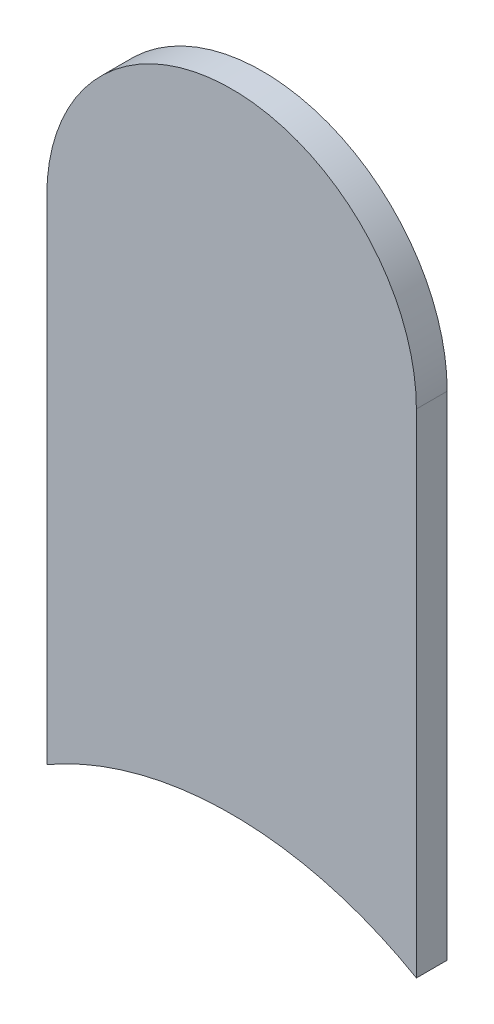
ISO-10303-21;
HEADER;
FILE_DESCRIPTION(('STEP AP214'),'2;1');
FILE_NAME('part.step','',(''),(''),'','','');
FILE_SCHEMA(('AUTOMOTIVE_DESIGN { 1 0 10303 214 1 1 1 1 }'));
ENDSEC;
DATA;
#1=APPLICATION_CONTEXT('core data for automotive mechanical design processes');
#2=APPLICATION_PROTOCOL_DEFINITION('international standard','automotive_design',2000,#1);
#3=PRODUCT_CONTEXT('',#1,'mechanical');
#4=PRODUCT('Part','Part','',(#3));
#5=PRODUCT_RELATED_PRODUCT_CATEGORY('part','',(#4));
#6=PRODUCT_DEFINITION_FORMATION('','',#4);
#7=PRODUCT_DEFINITION_CONTEXT('part definition',#1,'design');
#8=PRODUCT_DEFINITION('design','',#6,#7);
#9=PRODUCT_DEFINITION_SHAPE('','',#8);
#10=(LENGTH_UNIT() NAMED_UNIT(*) SI_UNIT(.MILLI.,.METRE.));
#11=(NAMED_UNIT(*) PLANE_ANGLE_UNIT() SI_UNIT($,.RADIAN.));
#12=(NAMED_UNIT(*) SI_UNIT($,.STERADIAN.) SOLID_ANGLE_UNIT());
#13=UNCERTAINTY_MEASURE_WITH_UNIT(LENGTH_MEASURE(1.E-05),#10,'distance_accuracy_value','');
#14=(GEOMETRIC_REPRESENTATION_CONTEXT(3) GLOBAL_UNCERTAINTY_ASSIGNED_CONTEXT((#13)) GLOBAL_UNIT_ASSIGNED_CONTEXT((#10,
#11,#12)) REPRESENTATION_CONTEXT('',''));
#15=CARTESIAN_POINT('',(0.,0.,0.));
#16=DIRECTION('',(0.,0.,1.));
#17=DIRECTION('',(1.,0.,0.));
#18=AXIS2_PLACEMENT_3D('',#15,#16,#17);
#19=CARTESIAN_POINT('',(19.05,-32.9955678841871,3.175));
#20=DIRECTION('',(0.,0.,-1.));
#21=DIRECTION('',(-1.,0.,0.));
#22=AXIS2_PLACEMENT_3D('',#19,#20,#21);
#23=CYLINDRICAL_SURFACE('',#22,38.1);
#24=CARTESIAN_POINT('',(19.05,-32.9955678841871,0.));
#25=DIRECTION('',(0.,0.,-1.));
#26=DIRECTION('',(-1.,0.,0.));
#27=AXIS2_PLACEMENT_3D('',#24,#25,#26);
#28=CIRCLE('',#27,38.1);
#29=CARTESIAN_POINT('',(0.,0.,0.));
#30=VERTEX_POINT('',#29);
#31=CARTESIAN_POINT('',(38.1,0.,0.));
#32=VERTEX_POINT('',#31);
#33=EDGE_CURVE('E102',#30,#32,#28,.T.);
#34=ORIENTED_EDGE('',*,*,#33,.T.);
#35=DIRECTION('',(0.,0.,-1.));
#36=VECTOR('',#35,1.);
#37=CARTESIAN_POINT('',(38.1,0.,3.175));
#38=LINE('',#37,#36);
#39=CARTESIAN_POINT('',(38.1,0.,3.175));
#40=VERTEX_POINT('',#39);
#41=EDGE_CURVE('E11',#40,#32,#38,.T.);
#42=ORIENTED_EDGE('',*,*,#41,.F.);
#43=CARTESIAN_POINT('',(19.05,-32.9955678841871,3.175));
#44=DIRECTION('',(0.,0.,-1.));
#45=DIRECTION('',(-1.,0.,0.));
#46=AXIS2_PLACEMENT_3D('',#43,#44,#45);
#47=CIRCLE('',#46,38.1);
#48=CARTESIAN_POINT('',(0.,0.,3.175));
#49=VERTEX_POINT('',#48);
#50=EDGE_CURVE('E90',#49,#40,#47,.T.);
#51=ORIENTED_EDGE('',*,*,#50,.F.);
#52=DIRECTION('',(0.,0.,-1.));
#53=VECTOR('',#52,1.);
#54=CARTESIAN_POINT('',(0.,0.,3.175));
#55=LINE('',#54,#53);
#56=EDGE_CURVE('E98',#49,#30,#55,.T.);
#57=ORIENTED_EDGE('',*,*,#56,.T.);
#58=EDGE_LOOP('',(#34,#42,#51,#57));
#59=FACE_BOUND('',#58,.T.);
#60=ADVANCED_FACE('F39',(#59),#23,.F.);
#61=CARTESIAN_POINT('',(38.1,0.,3.175));
#62=DIRECTION('',(-1.,0.,0.));
#63=DIRECTION('',(0.,0.,1.));
#64=AXIS2_PLACEMENT_3D('',#61,#62,#63);
#65=PLANE('',#64);
#66=DIRECTION('',(0.,1.,0.));
#67=VECTOR('',#66,1.);
#68=CARTESIAN_POINT('',(38.1,0.,0.));
#69=LINE('',#68,#67);
#70=CARTESIAN_POINT('',(38.1,50.8,0.));
#71=VERTEX_POINT('',#70);
#72=EDGE_CURVE('E94',#32,#71,#69,.T.);
#73=ORIENTED_EDGE('',*,*,#72,.T.);
#74=DIRECTION('',(0.,0.,-1.));
#75=VECTOR('',#74,1.);
#76=CARTESIAN_POINT('',(38.1,50.8,3.175));
#77=LINE('',#76,#75);
#78=CARTESIAN_POINT('',(38.1,50.8,3.175));
#79=VERTEX_POINT('',#78);
#80=EDGE_CURVE('E47',#79,#71,#77,.T.);
#81=ORIENTED_EDGE('',*,*,#80,.F.);
#82=DIRECTION('',(0.,1.,0.));
#83=VECTOR('',#82,1.);
#84=CARTESIAN_POINT('',(38.1,0.,3.175));
#85=LINE('',#84,#83);
#86=EDGE_CURVE('E85',#40,#79,#85,.T.);
#87=ORIENTED_EDGE('',*,*,#86,.F.);
#88=ORIENTED_EDGE('',*,*,#41,.T.);
#89=EDGE_LOOP('',(#73,#81,#87,#88));
#90=FACE_BOUND('',#89,.T.);
#91=ADVANCED_FACE('F93',(#90),#65,.F.);
#92=CARTESIAN_POINT('',(19.05,50.8,3.175));
#93=DIRECTION('',(0.,0.,-1.));
#94=DIRECTION('',(-1.,0.,0.));
#95=AXIS2_PLACEMENT_3D('',#92,#93,#94);
#96=CYLINDRICAL_SURFACE('',#95,19.05);
#97=CARTESIAN_POINT('',(19.05,50.8,0.));
#98=DIRECTION('',(0.,0.,1.));
#99=DIRECTION('',(-1.,0.,0.));
#100=AXIS2_PLACEMENT_3D('',#97,#98,#99);
#101=CIRCLE('',#100,19.05);
#102=CARTESIAN_POINT('',(0.,50.8,0.));
#103=VERTEX_POINT('',#102);
#104=EDGE_CURVE('E72',#71,#103,#101,.T.);
#105=ORIENTED_EDGE('',*,*,#104,.T.);
#106=DIRECTION('',(0.,0.,-1.));
#107=VECTOR('',#106,1.);
#108=CARTESIAN_POINT('',(0.,50.8,3.175));
#109=LINE('',#108,#107);
#110=CARTESIAN_POINT('',(0.,50.8,3.175));
#111=VERTEX_POINT('',#110);
#112=EDGE_CURVE('E95',#111,#103,#109,.T.);
#113=ORIENTED_EDGE('',*,*,#112,.F.);
#114=CARTESIAN_POINT('',(19.05,50.8,3.175));
#115=DIRECTION('',(0.,0.,1.));
#116=DIRECTION('',(-1.,0.,0.));
#117=AXIS2_PLACEMENT_3D('',#114,#115,#116);
#118=CIRCLE('',#117,19.05);
#119=EDGE_CURVE('E88',#79,#111,#118,.T.);
#120=ORIENTED_EDGE('',*,*,#119,.F.);
#121=ORIENTED_EDGE('',*,*,#80,.T.);
#122=EDGE_LOOP('',(#105,#113,#120,#121));
#123=FACE_BOUND('',#122,.T.);
#124=ADVANCED_FACE('F96',(#123),#96,.T.);
#125=CARTESIAN_POINT('',(0.,0.,3.175));
#126=DIRECTION('',(1.,0.,0.));
#127=DIRECTION('',(0.,0.,-1.));
#128=AXIS2_PLACEMENT_3D('',#125,#126,#127);
#129=PLANE('',#128);
#130=DIRECTION('',(0.,-1.,0.));
#131=VECTOR('',#130,1.);
#132=CARTESIAN_POINT('',(0.,0.,0.));
#133=LINE('',#132,#131);
#134=EDGE_CURVE('E78',#103,#30,#133,.T.);
#135=ORIENTED_EDGE('',*,*,#134,.T.);
#136=ORIENTED_EDGE('',*,*,#56,.F.);
#137=DIRECTION('',(0.,-1.,0.));
#138=VECTOR('',#137,1.);
#139=CARTESIAN_POINT('',(0.,0.,3.175));
#140=LINE('',#139,#138);
#141=EDGE_CURVE('E55',#111,#49,#140,.T.);
#142=ORIENTED_EDGE('',*,*,#141,.F.);
#143=ORIENTED_EDGE('',*,*,#112,.T.);
#144=EDGE_LOOP('',(#135,#136,#142,#143));
#145=FACE_BOUND('',#144,.T.);
#146=ADVANCED_FACE('F109',(#145),#129,.F.);
#147=CARTESIAN_POINT('',(19.05,-32.9955678841871,3.175));
#148=DIRECTION('',(0.,0.,-1.));
#149=DIRECTION('',(-1.,0.,0.));
#150=AXIS2_PLACEMENT_3D('',#147,#148,#149);
#151=PLANE('',#150);
#152=ORIENTED_EDGE('',*,*,#50,.T.);
#153=ORIENTED_EDGE('',*,*,#86,.T.);
#154=ORIENTED_EDGE('',*,*,#119,.T.);
#155=ORIENTED_EDGE('',*,*,#141,.T.);
#156=EDGE_LOOP('',(#152,#153,#154,#155));
#157=FACE_BOUND('',#156,.T.);
#158=ADVANCED_FACE('F86',(#157),#151,.F.);
#159=CARTESIAN_POINT('',(19.05,-32.9955678841871,0.));
#160=DIRECTION('',(0.,0.,-1.));
#161=DIRECTION('',(-1.,0.,0.));
#162=AXIS2_PLACEMENT_3D('',#159,#160,#161);
#163=PLANE('',#162);
#164=ORIENTED_EDGE('',*,*,#33,.F.);
#165=ORIENTED_EDGE('',*,*,#134,.F.);
#166=ORIENTED_EDGE('',*,*,#104,.F.);
#167=ORIENTED_EDGE('',*,*,#72,.F.);
#168=EDGE_LOOP('',(#164,#165,#166,#167));
#169=FACE_BOUND('',#168,.T.);
#170=ADVANCED_FACE('F112',(#169),#163,.T.);
#171=CLOSED_SHELL('',(#60,#91,#124,#146,#158,#170));
#172=MANIFOLD_SOLID_BREP('B2',#171);
#173=ADVANCED_BREP_SHAPE_REPRESENTATION('',(#18,#172),#14);
#174=SHAPE_DEFINITION_REPRESENTATION(#9,#173);
ENDSEC;
END-ISO-10303-21;
